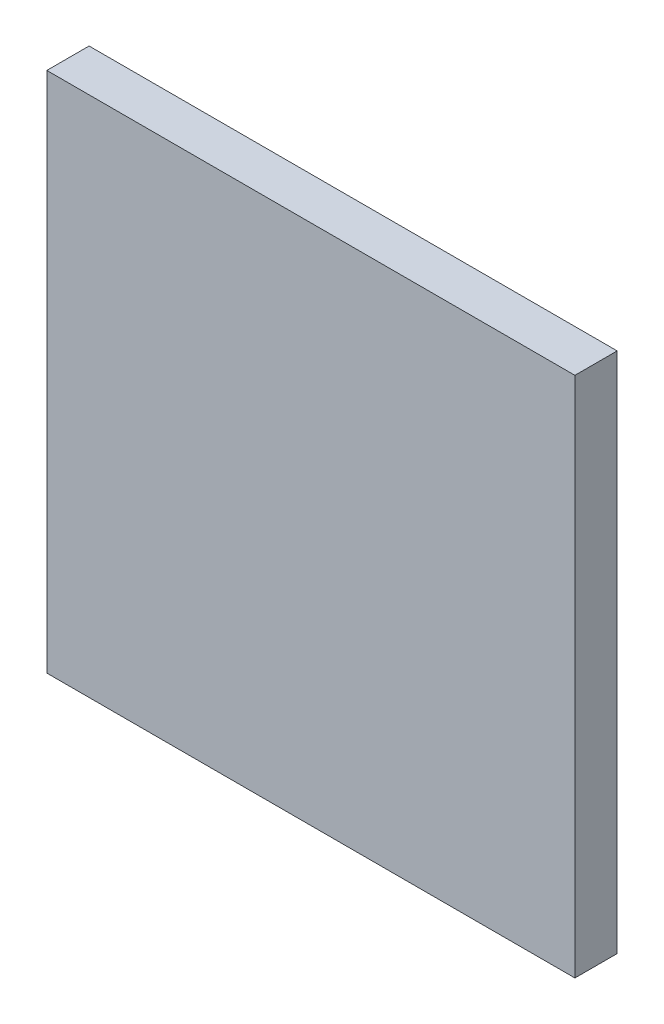
ISO-10303-21;
HEADER;
FILE_DESCRIPTION(('STEP AP214'),'2;1');
FILE_NAME('part.step','',(''),(''),'','','');
FILE_SCHEMA(('AUTOMOTIVE_DESIGN { 1 0 10303 214 1 1 1 1 }'));
ENDSEC;
DATA;
#1=APPLICATION_CONTEXT('core data for automotive mechanical design processes');
#2=APPLICATION_PROTOCOL_DEFINITION('international standard','automotive_design',2000,#1);
#3=PRODUCT_CONTEXT('',#1,'mechanical');
#4=PRODUCT('Part','Part','',(#3));
#5=PRODUCT_RELATED_PRODUCT_CATEGORY('part','',(#4));
#6=PRODUCT_DEFINITION_FORMATION('','',#4);
#7=PRODUCT_DEFINITION_CONTEXT('part definition',#1,'design');
#8=PRODUCT_DEFINITION('design','',#6,#7);
#9=PRODUCT_DEFINITION_SHAPE('','',#8);
#10=(LENGTH_UNIT() NAMED_UNIT(*) SI_UNIT(.MILLI.,.METRE.));
#11=(NAMED_UNIT(*) PLANE_ANGLE_UNIT() SI_UNIT($,.RADIAN.));
#12=(NAMED_UNIT(*) SI_UNIT($,.STERADIAN.) SOLID_ANGLE_UNIT());
#13=UNCERTAINTY_MEASURE_WITH_UNIT(LENGTH_MEASURE(1.E-05),#10,'distance_accuracy_value','');
#14=(GEOMETRIC_REPRESENTATION_CONTEXT(3) GLOBAL_UNCERTAINTY_ASSIGNED_CONTEXT((#13)) GLOBAL_UNIT_ASSIGNED_CONTEXT((#10,
#11,#12)) REPRESENTATION_CONTEXT('',''));
#15=CARTESIAN_POINT('',(0.,0.,0.));
#16=DIRECTION('',(0.,0.,1.));
#17=DIRECTION('',(1.,0.,0.));
#18=AXIS2_PLACEMENT_3D('',#15,#16,#17);
#19=CARTESIAN_POINT('',(-6.245,-5.745,1.));
#20=DIRECTION('',(1.,0.,0.));
#21=DIRECTION('',(0.,0.,-1.));
#22=AXIS2_PLACEMENT_3D('',#19,#20,#21);
#23=PLANE('',#22);
#24=DIRECTION('',(0.,-1.,0.));
#25=VECTOR('',#24,1.);
#26=CARTESIAN_POINT('',(-6.245,-5.745,0.));
#27=LINE('',#26,#25);
#28=CARTESIAN_POINT('',(-6.245,6.599703,0.));
#29=VERTEX_POINT('',#28);
#30=CARTESIAN_POINT('',(-6.245,-5.745,0.));
#31=VERTEX_POINT('',#30);
#32=EDGE_CURVE('E95',#29,#31,#27,.T.);
#33=ORIENTED_EDGE('',*,*,#32,.T.);
#34=DIRECTION('',(0.,0.,-1.));
#35=VECTOR('',#34,1.);
#36=CARTESIAN_POINT('',(-6.245,-5.745,1.));
#37=LINE('',#36,#35);
#38=CARTESIAN_POINT('',(-6.245,-5.745,1.));
#39=VERTEX_POINT('',#38);
#40=EDGE_CURVE('E11',#39,#31,#37,.T.);
#41=ORIENTED_EDGE('',*,*,#40,.F.);
#42=DIRECTION('',(0.,-1.,0.));
#43=VECTOR('',#42,1.);
#44=CARTESIAN_POINT('',(-6.245,-5.745,1.));
#45=LINE('',#44,#43);
#46=CARTESIAN_POINT('',(-6.245,6.599703,1.));
#47=VERTEX_POINT('',#46);
#48=EDGE_CURVE('E83',#47,#39,#45,.T.);
#49=ORIENTED_EDGE('',*,*,#48,.F.);
#50=DIRECTION('',(0.,0.,-1.));
#51=VECTOR('',#50,1.);
#52=CARTESIAN_POINT('',(-6.245,6.599703,1.));
#53=LINE('',#52,#51);
#54=EDGE_CURVE('E91',#47,#29,#53,.T.);
#55=ORIENTED_EDGE('',*,*,#54,.T.);
#56=EDGE_LOOP('',(#33,#41,#49,#55));
#57=FACE_BOUND('',#56,.T.);
#58=ADVANCED_FACE('F32',(#57),#23,.F.);
#59=CARTESIAN_POINT('',(6.245,-5.745,1.));
#60=DIRECTION('',(0.,1.,0.));
#61=DIRECTION('',(0.,0.,1.));
#62=AXIS2_PLACEMENT_3D('',#59,#60,#61);
#63=PLANE('',#62);
#64=DIRECTION('',(1.,0.,0.));
#65=VECTOR('',#64,1.);
#66=CARTESIAN_POINT('',(6.245,-5.745,0.));
#67=LINE('',#66,#65);
#68=CARTESIAN_POINT('',(6.245,-5.745,0.));
#69=VERTEX_POINT('',#68);
#70=EDGE_CURVE('E87',#31,#69,#67,.T.);
#71=ORIENTED_EDGE('',*,*,#70,.T.);
#72=DIRECTION('',(0.,0.,-1.));
#73=VECTOR('',#72,1.);
#74=CARTESIAN_POINT('',(6.245,-5.745,1.));
#75=LINE('',#74,#73);
#76=CARTESIAN_POINT('',(6.245,-5.745,1.));
#77=VERTEX_POINT('',#76);
#78=EDGE_CURVE('E40',#77,#69,#75,.T.);
#79=ORIENTED_EDGE('',*,*,#78,.F.);
#80=DIRECTION('',(1.,0.,0.));
#81=VECTOR('',#80,1.);
#82=CARTESIAN_POINT('',(6.245,-5.745,1.));
#83=LINE('',#82,#81);
#84=EDGE_CURVE('E78',#39,#77,#83,.T.);
#85=ORIENTED_EDGE('',*,*,#84,.F.);
#86=ORIENTED_EDGE('',*,*,#40,.T.);
#87=EDGE_LOOP('',(#71,#79,#85,#86));
#88=FACE_BOUND('',#87,.T.);
#89=ADVANCED_FACE('F86',(#88),#63,.F.);
#90=CARTESIAN_POINT('',(6.245,6.599703,1.));
#91=DIRECTION('',(-1.,0.,0.));
#92=DIRECTION('',(0.,0.,1.));
#93=AXIS2_PLACEMENT_3D('',#90,#91,#92);
#94=PLANE('',#93);
#95=DIRECTION('',(0.,1.,0.));
#96=VECTOR('',#95,1.);
#97=CARTESIAN_POINT('',(6.245,6.599703,0.));
#98=LINE('',#97,#96);
#99=CARTESIAN_POINT('',(6.245,6.599703,0.));
#100=VERTEX_POINT('',#99);
#101=EDGE_CURVE('E65',#69,#100,#98,.T.);
#102=ORIENTED_EDGE('',*,*,#101,.T.);
#103=DIRECTION('',(0.,0.,-1.));
#104=VECTOR('',#103,1.);
#105=CARTESIAN_POINT('',(6.245,6.599703,1.));
#106=LINE('',#105,#104);
#107=CARTESIAN_POINT('',(6.245,6.599703,1.));
#108=VERTEX_POINT('',#107);
#109=EDGE_CURVE('E88',#108,#100,#106,.T.);
#110=ORIENTED_EDGE('',*,*,#109,.F.);
#111=DIRECTION('',(0.,1.,0.));
#112=VECTOR('',#111,1.);
#113=CARTESIAN_POINT('',(6.245,6.599703,1.));
#114=LINE('',#113,#112);
#115=EDGE_CURVE('E81',#77,#108,#114,.T.);
#116=ORIENTED_EDGE('',*,*,#115,.F.);
#117=ORIENTED_EDGE('',*,*,#78,.T.);
#118=EDGE_LOOP('',(#102,#110,#116,#117));
#119=FACE_BOUND('',#118,.T.);
#120=ADVANCED_FACE('F89',(#119),#94,.F.);
#121=CARTESIAN_POINT('',(-6.245,6.599703,1.));
#122=DIRECTION('',(0.,-1.,0.));
#123=DIRECTION('',(0.,0.,-1.));
#124=AXIS2_PLACEMENT_3D('',#121,#122,#123);
#125=PLANE('',#124);
#126=DIRECTION('',(-1.,0.,0.));
#127=VECTOR('',#126,1.);
#128=CARTESIAN_POINT('',(-6.245,6.599703,0.));
#129=LINE('',#128,#127);
#130=EDGE_CURVE('E71',#100,#29,#129,.T.);
#131=ORIENTED_EDGE('',*,*,#130,.T.);
#132=ORIENTED_EDGE('',*,*,#54,.F.);
#133=DIRECTION('',(-1.,0.,0.));
#134=VECTOR('',#133,1.);
#135=CARTESIAN_POINT('',(-6.245,6.599703,1.));
#136=LINE('',#135,#134);
#137=EDGE_CURVE('E48',#108,#47,#136,.T.);
#138=ORIENTED_EDGE('',*,*,#137,.F.);
#139=ORIENTED_EDGE('',*,*,#109,.T.);
#140=EDGE_LOOP('',(#131,#132,#138,#139));
#141=FACE_BOUND('',#140,.T.);
#142=ADVANCED_FACE('F102',(#141),#125,.F.);
#143=CARTESIAN_POINT('',(0.,0.,1.));
#144=DIRECTION('',(0.,0.,-1.));
#145=DIRECTION('',(-1.,0.,0.));
#146=AXIS2_PLACEMENT_3D('',#143,#144,#145);
#147=PLANE('',#146);
#148=ORIENTED_EDGE('',*,*,#48,.T.);
#149=ORIENTED_EDGE('',*,*,#84,.T.);
#150=ORIENTED_EDGE('',*,*,#115,.T.);
#151=ORIENTED_EDGE('',*,*,#137,.T.);
#152=EDGE_LOOP('',(#148,#149,#150,#151));
#153=FACE_BOUND('',#152,.T.);
#154=ADVANCED_FACE('F79',(#153),#147,.F.);
#155=CARTESIAN_POINT('',(0.,0.,0.));
#156=DIRECTION('',(0.,0.,-1.));
#157=DIRECTION('',(-1.,0.,0.));
#158=AXIS2_PLACEMENT_3D('',#155,#156,#157);
#159=PLANE('',#158);
#160=ORIENTED_EDGE('',*,*,#32,.F.);
#161=ORIENTED_EDGE('',*,*,#130,.F.);
#162=ORIENTED_EDGE('',*,*,#101,.F.);
#163=ORIENTED_EDGE('',*,*,#70,.F.);
#164=EDGE_LOOP('',(#160,#161,#162,#163));
#165=FACE_BOUND('',#164,.T.);
#166=ADVANCED_FACE('F105',(#165),#159,.T.);
#167=CLOSED_SHELL('',(#58,#89,#120,#142,#154,#166));
#168=MANIFOLD_SOLID_BREP('B2',#167);
#169=ADVANCED_BREP_SHAPE_REPRESENTATION('',(#18,#168),#14);
#170=SHAPE_DEFINITION_REPRESENTATION(#9,#169);
ENDSEC;
END-ISO-10303-21;
